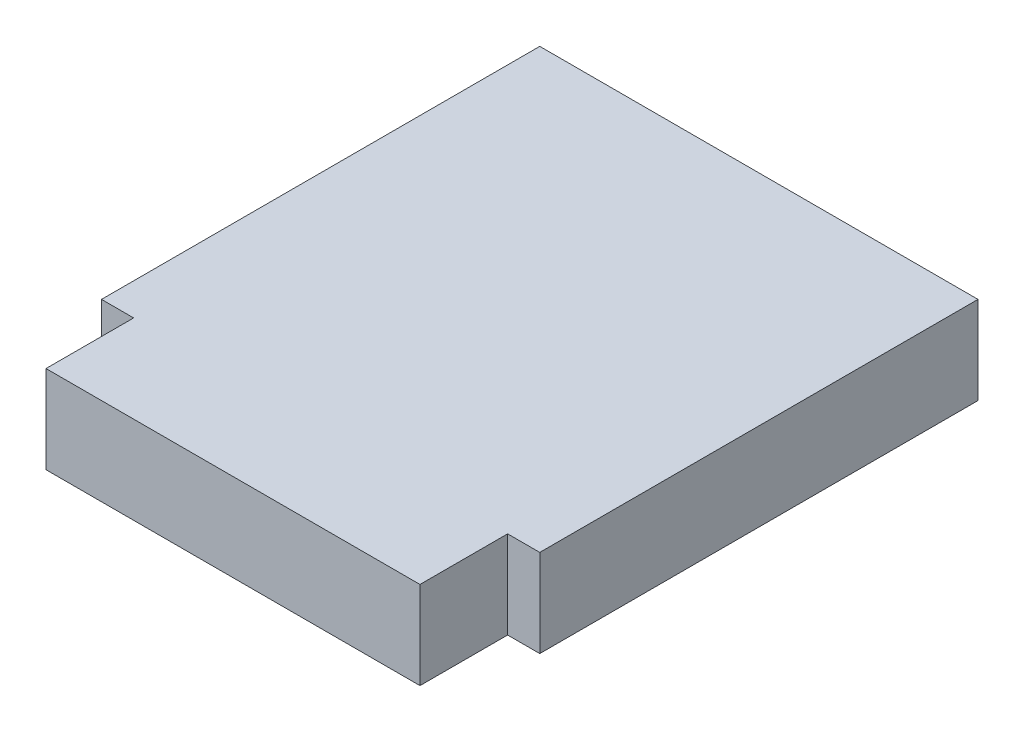
ISO-10303-21;
HEADER;
FILE_DESCRIPTION(('STEP AP214'),'2;1');
FILE_NAME('part.step','',(''),(''),'','','');
FILE_SCHEMA(('AUTOMOTIVE_DESIGN { 1 0 10303 214 1 1 1 1 }'));
ENDSEC;
DATA;
#1=APPLICATION_CONTEXT('core data for automotive mechanical design processes');
#2=APPLICATION_PROTOCOL_DEFINITION('international standard','automotive_design',2000,#1);
#3=PRODUCT_CONTEXT('',#1,'mechanical');
#4=PRODUCT('Part','Part','',(#3));
#5=PRODUCT_RELATED_PRODUCT_CATEGORY('part','',(#4));
#6=PRODUCT_DEFINITION_FORMATION('','',#4);
#7=PRODUCT_DEFINITION_CONTEXT('part definition',#1,'design');
#8=PRODUCT_DEFINITION('design','',#6,#7);
#9=PRODUCT_DEFINITION_SHAPE('','',#8);
#10=(LENGTH_UNIT() NAMED_UNIT(*) SI_UNIT(.MILLI.,.METRE.));
#11=(NAMED_UNIT(*) PLANE_ANGLE_UNIT() SI_UNIT($,.RADIAN.));
#12=(NAMED_UNIT(*) SI_UNIT($,.STERADIAN.) SOLID_ANGLE_UNIT());
#13=UNCERTAINTY_MEASURE_WITH_UNIT(LENGTH_MEASURE(1.E-05),#10,'distance_accuracy_value','');
#14=(GEOMETRIC_REPRESENTATION_CONTEXT(3) GLOBAL_UNCERTAINTY_ASSIGNED_CONTEXT((#13)) GLOBAL_UNIT_ASSIGNED_CONTEXT((#10,
#11,#12)) REPRESENTATION_CONTEXT('',''));
#15=CARTESIAN_POINT('',(0.,0.,0.));
#16=DIRECTION('',(0.,0.,1.));
#17=DIRECTION('',(1.,0.,0.));
#18=AXIS2_PLACEMENT_3D('',#15,#16,#17);
#19=CARTESIAN_POINT('',(0.,3.,0.));
#20=DIRECTION('',(1.,0.,0.));
#21=DIRECTION('',(0.,0.,-1.));
#22=AXIS2_PLACEMENT_3D('',#19,#20,#21);
#23=PLANE('',#22);
#24=DIRECTION('',(0.,0.,1.));
#25=VECTOR('',#24,1.);
#26=CARTESIAN_POINT('',(0.,0.,0.));
#27=LINE('',#26,#25);
#28=CARTESIAN_POINT('',(0.,0.,-3.));
#29=VERTEX_POINT('',#28);
#30=CARTESIAN_POINT('',(0.,0.,0.));
#31=VERTEX_POINT('',#30);
#32=EDGE_CURVE('E129',#29,#31,#27,.T.);
#33=ORIENTED_EDGE('',*,*,#32,.T.);
#34=DIRECTION('',(0.,-1.,0.));
#35=VECTOR('',#34,1.);
#36=CARTESIAN_POINT('',(0.,3.,0.));
#37=LINE('',#36,#35);
#38=CARTESIAN_POINT('',(0.,3.,0.));
#39=VERTEX_POINT('',#38);
#40=EDGE_CURVE('E11',#39,#31,#37,.T.);
#41=ORIENTED_EDGE('',*,*,#40,.F.);
#42=DIRECTION('',(0.,0.,1.));
#43=VECTOR('',#42,1.);
#44=CARTESIAN_POINT('',(0.,3.,0.));
#45=LINE('',#44,#43);
#46=CARTESIAN_POINT('',(0.,3.,-3.));
#47=VERTEX_POINT('',#46);
#48=EDGE_CURVE('E143',#47,#39,#45,.T.);
#49=ORIENTED_EDGE('',*,*,#48,.F.);
#50=DIRECTION('',(0.,-1.,0.));
#51=VECTOR('',#50,1.);
#52=CARTESIAN_POINT('',(0.,3.,-3.));
#53=LINE('',#52,#51);
#54=EDGE_CURVE('E125',#47,#29,#53,.T.);
#55=ORIENTED_EDGE('',*,*,#54,.T.);
#56=EDGE_LOOP('',(#33,#41,#49,#55));
#57=FACE_BOUND('',#56,.T.);
#58=ADVANCED_FACE('F33',(#57),#23,.F.);
#59=CARTESIAN_POINT('',(0.,3.,0.));
#60=DIRECTION('',(0.,0.,-1.));
#61=DIRECTION('',(-1.,0.,0.));
#62=AXIS2_PLACEMENT_3D('',#59,#60,#61);
#63=PLANE('',#62);
#64=DIRECTION('',(1.,0.,0.));
#65=VECTOR('',#64,1.);
#66=CARTESIAN_POINT('',(0.,0.,0.));
#67=LINE('',#66,#65);
#68=CARTESIAN_POINT('',(12.8,0.,0.));
#69=VERTEX_POINT('',#68);
#70=EDGE_CURVE('E132',#31,#69,#67,.T.);
#71=ORIENTED_EDGE('',*,*,#70,.T.);
#72=DIRECTION('',(0.,-1.,0.));
#73=VECTOR('',#72,1.);
#74=CARTESIAN_POINT('',(12.8,3.,0.));
#75=LINE('',#74,#73);
#76=CARTESIAN_POINT('',(12.8,3.,0.));
#77=VERTEX_POINT('',#76);
#78=EDGE_CURVE('E41',#77,#69,#75,.T.);
#79=ORIENTED_EDGE('',*,*,#78,.F.);
#80=DIRECTION('',(1.,0.,0.));
#81=VECTOR('',#80,1.);
#82=CARTESIAN_POINT('',(0.,3.,0.));
#83=LINE('',#82,#81);
#84=EDGE_CURVE('E92',#39,#77,#83,.T.);
#85=ORIENTED_EDGE('',*,*,#84,.F.);
#86=ORIENTED_EDGE('',*,*,#40,.T.);
#87=EDGE_LOOP('',(#71,#79,#85,#86));
#88=FACE_BOUND('',#87,.T.);
#89=ADVANCED_FACE('F178',(#88),#63,.F.);
#90=CARTESIAN_POINT('',(12.8,3.,0.));
#91=DIRECTION('',(-1.,0.,0.));
#92=DIRECTION('',(0.,0.,1.));
#93=AXIS2_PLACEMENT_3D('',#90,#91,#92);
#94=PLANE('',#93);
#95=DIRECTION('',(0.,0.,-1.));
#96=VECTOR('',#95,1.);
#97=CARTESIAN_POINT('',(12.8,0.,0.));
#98=LINE('',#97,#96);
#99=CARTESIAN_POINT('',(12.8,0.,-3.));
#100=VERTEX_POINT('',#99);
#101=EDGE_CURVE('E134',#69,#100,#98,.T.);
#102=ORIENTED_EDGE('',*,*,#101,.T.);
#103=DIRECTION('',(0.,-1.,0.));
#104=VECTOR('',#103,1.);
#105=CARTESIAN_POINT('',(12.8,3.,-3.));
#106=LINE('',#105,#104);
#107=CARTESIAN_POINT('',(12.8,3.,-3.));
#108=VERTEX_POINT('',#107);
#109=EDGE_CURVE('E150',#108,#100,#106,.T.);
#110=ORIENTED_EDGE('',*,*,#109,.F.);
#111=DIRECTION('',(0.,0.,-1.));
#112=VECTOR('',#111,1.);
#113=CARTESIAN_POINT('',(12.8,3.,0.));
#114=LINE('',#113,#112);
#115=EDGE_CURVE('E158',#77,#108,#114,.T.);
#116=ORIENTED_EDGE('',*,*,#115,.F.);
#117=ORIENTED_EDGE('',*,*,#78,.T.);
#118=EDGE_LOOP('',(#102,#110,#116,#117));
#119=FACE_BOUND('',#118,.T.);
#120=ADVANCED_FACE('F156',(#119),#94,.F.);
#121=CARTESIAN_POINT('',(12.8,3.,-3.));
#122=DIRECTION('',(0.,0.,-1.));
#123=DIRECTION('',(-1.,0.,0.));
#124=AXIS2_PLACEMENT_3D('',#121,#122,#123);
#125=PLANE('',#124);
#126=DIRECTION('',(1.,0.,0.));
#127=VECTOR('',#126,1.);
#128=CARTESIAN_POINT('',(12.8,0.,-3.));
#129=LINE('',#128,#127);
#130=CARTESIAN_POINT('',(13.9,0.,-3.));
#131=VERTEX_POINT('',#130);
#132=EDGE_CURVE('E136',#100,#131,#129,.T.);
#133=ORIENTED_EDGE('',*,*,#132,.T.);
#134=DIRECTION('',(0.,-1.,0.));
#135=VECTOR('',#134,1.);
#136=CARTESIAN_POINT('',(13.9,3.,-3.));
#137=LINE('',#136,#135);
#138=CARTESIAN_POINT('',(13.9,3.,-3.));
#139=VERTEX_POINT('',#138);
#140=EDGE_CURVE('E147',#139,#131,#137,.T.);
#141=ORIENTED_EDGE('',*,*,#140,.F.);
#142=DIRECTION('',(1.,0.,0.));
#143=VECTOR('',#142,1.);
#144=CARTESIAN_POINT('',(12.8,3.,-3.));
#145=LINE('',#144,#143);
#146=EDGE_CURVE('E170',#108,#139,#145,.T.);
#147=ORIENTED_EDGE('',*,*,#146,.F.);
#148=ORIENTED_EDGE('',*,*,#109,.T.);
#149=EDGE_LOOP('',(#133,#141,#147,#148));
#150=FACE_BOUND('',#149,.T.);
#151=ADVANCED_FACE('F166',(#150),#125,.F.);
#152=CARTESIAN_POINT('',(13.9,3.,-3.));
#153=DIRECTION('',(-1.,0.,0.));
#154=DIRECTION('',(0.,0.,1.));
#155=AXIS2_PLACEMENT_3D('',#152,#153,#154);
#156=PLANE('',#155);
#157=DIRECTION('',(0.,0.,-1.));
#158=VECTOR('',#157,1.);
#159=CARTESIAN_POINT('',(13.9,0.,-3.));
#160=LINE('',#159,#158);
#161=CARTESIAN_POINT('',(13.9,0.,-18.));
#162=VERTEX_POINT('',#161);
#163=EDGE_CURVE('E138',#131,#162,#160,.T.);
#164=ORIENTED_EDGE('',*,*,#163,.T.);
#165=DIRECTION('',(0.,-1.,0.));
#166=VECTOR('',#165,1.);
#167=CARTESIAN_POINT('',(13.9,3.,-18.));
#168=LINE('',#167,#166);
#169=CARTESIAN_POINT('',(13.9,3.,-18.));
#170=VERTEX_POINT('',#169);
#171=EDGE_CURVE('E120',#170,#162,#168,.T.);
#172=ORIENTED_EDGE('',*,*,#171,.F.);
#173=DIRECTION('',(0.,0.,-1.));
#174=VECTOR('',#173,1.);
#175=CARTESIAN_POINT('',(13.9,3.,-3.));
#176=LINE('',#175,#174);
#177=EDGE_CURVE('E111',#139,#170,#176,.T.);
#178=ORIENTED_EDGE('',*,*,#177,.F.);
#179=ORIENTED_EDGE('',*,*,#140,.T.);
#180=EDGE_LOOP('',(#164,#172,#178,#179));
#181=FACE_BOUND('',#180,.T.);
#182=ADVANCED_FACE('F169',(#181),#156,.F.);
#183=CARTESIAN_POINT('',(13.9,3.,-18.));
#184=DIRECTION('',(0.,0.,1.));
#185=DIRECTION('',(1.,0.,0.));
#186=AXIS2_PLACEMENT_3D('',#183,#184,#185);
#187=PLANE('',#186);
#188=DIRECTION('',(-1.,0.,0.));
#189=VECTOR('',#188,1.);
#190=CARTESIAN_POINT('',(13.9,0.,-18.));
#191=LINE('',#190,#189);
#192=CARTESIAN_POINT('',(-1.1,0.,-18.));
#193=VERTEX_POINT('',#192);
#194=EDGE_CURVE('E119',#162,#193,#191,.T.);
#195=ORIENTED_EDGE('',*,*,#194,.T.);
#196=DIRECTION('',(0.,-1.,0.));
#197=VECTOR('',#196,1.);
#198=CARTESIAN_POINT('',(-1.1,3.,-18.));
#199=LINE('',#198,#197);
#200=CARTESIAN_POINT('',(-1.1,3.,-18.));
#201=VERTEX_POINT('',#200);
#202=EDGE_CURVE('E116',#201,#193,#199,.T.);
#203=ORIENTED_EDGE('',*,*,#202,.F.);
#204=DIRECTION('',(-1.,0.,0.));
#205=VECTOR('',#204,1.);
#206=CARTESIAN_POINT('',(13.9,3.,-18.));
#207=LINE('',#206,#205);
#208=EDGE_CURVE('E105',#170,#201,#207,.T.);
#209=ORIENTED_EDGE('',*,*,#208,.F.);
#210=ORIENTED_EDGE('',*,*,#171,.T.);
#211=EDGE_LOOP('',(#195,#203,#209,#210));
#212=FACE_BOUND('',#211,.T.);
#213=ADVANCED_FACE('F117',(#212),#187,.F.);
#214=CARTESIAN_POINT('',(-1.1,3.,-18.));
#215=DIRECTION('',(1.,0.,0.));
#216=DIRECTION('',(0.,0.,-1.));
#217=AXIS2_PLACEMENT_3D('',#214,#215,#216);
#218=PLANE('',#217);
#219=DIRECTION('',(0.,0.,1.));
#220=VECTOR('',#219,1.);
#221=CARTESIAN_POINT('',(-1.1,0.,-18.));
#222=LINE('',#221,#220);
#223=CARTESIAN_POINT('',(-1.1,0.,-3.));
#224=VERTEX_POINT('',#223);
#225=EDGE_CURVE('E78',#193,#224,#222,.T.);
#226=ORIENTED_EDGE('',*,*,#225,.T.);
#227=DIRECTION('',(0.,-1.,0.));
#228=VECTOR('',#227,1.);
#229=CARTESIAN_POINT('',(-1.1,3.,-3.));
#230=LINE('',#229,#228);
#231=CARTESIAN_POINT('',(-1.1,3.,-3.));
#232=VERTEX_POINT('',#231);
#233=EDGE_CURVE('E121',#232,#224,#230,.T.);
#234=ORIENTED_EDGE('',*,*,#233,.F.);
#235=DIRECTION('',(0.,0.,1.));
#236=VECTOR('',#235,1.);
#237=CARTESIAN_POINT('',(-1.1,3.,-18.));
#238=LINE('',#237,#236);
#239=EDGE_CURVE('E109',#201,#232,#238,.T.);
#240=ORIENTED_EDGE('',*,*,#239,.F.);
#241=ORIENTED_EDGE('',*,*,#202,.T.);
#242=EDGE_LOOP('',(#226,#234,#240,#241));
#243=FACE_BOUND('',#242,.T.);
#244=ADVANCED_FACE('F123',(#243),#218,.F.);
#245=CARTESIAN_POINT('',(-1.1,3.,-3.));
#246=DIRECTION('',(0.,0.,-1.));
#247=DIRECTION('',(-1.,0.,0.));
#248=AXIS2_PLACEMENT_3D('',#245,#246,#247);
#249=PLANE('',#248);
#250=DIRECTION('',(1.,0.,0.));
#251=VECTOR('',#250,1.);
#252=CARTESIAN_POINT('',(-1.1,0.,-3.));
#253=LINE('',#252,#251);
#254=EDGE_CURVE('E84',#224,#29,#253,.T.);
#255=ORIENTED_EDGE('',*,*,#254,.T.);
#256=ORIENTED_EDGE('',*,*,#54,.F.);
#257=DIRECTION('',(1.,0.,0.));
#258=VECTOR('',#257,1.);
#259=CARTESIAN_POINT('',(-1.1,3.,-3.));
#260=LINE('',#259,#258);
#261=EDGE_CURVE('E49',#232,#47,#260,.T.);
#262=ORIENTED_EDGE('',*,*,#261,.F.);
#263=ORIENTED_EDGE('',*,*,#233,.T.);
#264=EDGE_LOOP('',(#255,#256,#262,#263));
#265=FACE_BOUND('',#264,.T.);
#266=ADVANCED_FACE('F194',(#265),#249,.F.);
#267=CARTESIAN_POINT('',(0.,3.,0.));
#268=DIRECTION('',(0.,-1.,0.));
#269=DIRECTION('',(0.,0.,-1.));
#270=AXIS2_PLACEMENT_3D('',#267,#268,#269);
#271=PLANE('',#270);
#272=ORIENTED_EDGE('',*,*,#48,.T.);
#273=ORIENTED_EDGE('',*,*,#84,.T.);
#274=ORIENTED_EDGE('',*,*,#115,.T.);
#275=ORIENTED_EDGE('',*,*,#146,.T.);
#276=ORIENTED_EDGE('',*,*,#177,.T.);
#277=ORIENTED_EDGE('',*,*,#208,.T.);
#278=ORIENTED_EDGE('',*,*,#239,.T.);
#279=ORIENTED_EDGE('',*,*,#261,.T.);
#280=EDGE_LOOP('',(#272,#273,#274,#275,#276,#277,#278,#279));
#281=FACE_BOUND('',#280,.T.);
#282=ADVANCED_FACE('F107',(#281),#271,.F.);
#283=CARTESIAN_POINT('',(0.,0.,0.));
#284=DIRECTION('',(0.,-1.,0.));
#285=DIRECTION('',(0.,0.,-1.));
#286=AXIS2_PLACEMENT_3D('',#283,#284,#285);
#287=PLANE('',#286);
#288=ORIENTED_EDGE('',*,*,#32,.F.);
#289=ORIENTED_EDGE('',*,*,#254,.F.);
#290=ORIENTED_EDGE('',*,*,#225,.F.);
#291=ORIENTED_EDGE('',*,*,#194,.F.);
#292=ORIENTED_EDGE('',*,*,#163,.F.);
#293=ORIENTED_EDGE('',*,*,#132,.F.);
#294=ORIENTED_EDGE('',*,*,#101,.F.);
#295=ORIENTED_EDGE('',*,*,#70,.F.);
#296=EDGE_LOOP('',(#288,#289,#290,#291,#292,#293,#294,#295));
#297=FACE_BOUND('',#296,.T.);
#298=ADVANCED_FACE('F162',(#297),#287,.T.);
#299=CLOSED_SHELL('',(#58,#89,#120,#151,#182,#213,#244,#266,#282,#298));
#300=MANIFOLD_SOLID_BREP('B2',#299);
#301=ADVANCED_BREP_SHAPE_REPRESENTATION('',(#18,#300),#14);
#302=SHAPE_DEFINITION_REPRESENTATION(#9,#301);
ENDSEC;
END-ISO-10303-21;
